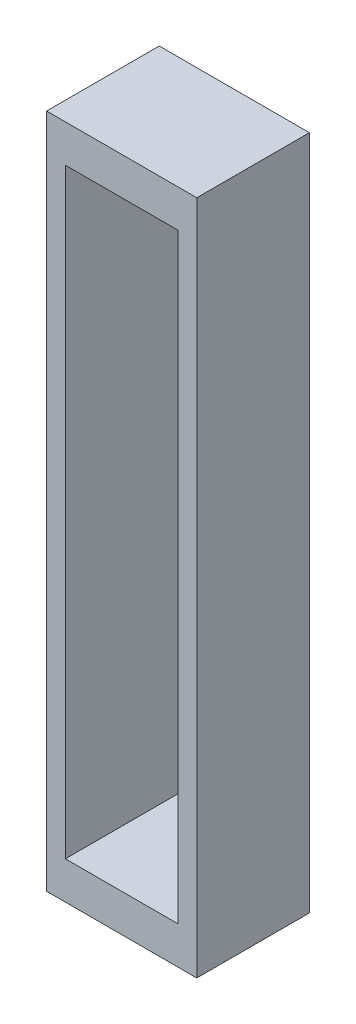
ISO-10303-21;
HEADER;
FILE_DESCRIPTION(('STEP AP214'),'2;1');
FILE_NAME('part.step','',(''),(''),'','','');
FILE_SCHEMA(('AUTOMOTIVE_DESIGN { 1 0 10303 214 1 1 1 1 }'));
ENDSEC;
DATA;
#1=APPLICATION_CONTEXT('core data for automotive mechanical design processes');
#2=APPLICATION_PROTOCOL_DEFINITION('international standard','automotive_design',2000,#1);
#3=PRODUCT_CONTEXT('',#1,'mechanical');
#4=PRODUCT('Part','Part','',(#3));
#5=PRODUCT_RELATED_PRODUCT_CATEGORY('part','',(#4));
#6=PRODUCT_DEFINITION_FORMATION('','',#4);
#7=PRODUCT_DEFINITION_CONTEXT('part definition',#1,'design');
#8=PRODUCT_DEFINITION('design','',#6,#7);
#9=PRODUCT_DEFINITION_SHAPE('','',#8);
#10=(LENGTH_UNIT() NAMED_UNIT(*) SI_UNIT(.MILLI.,.METRE.));
#11=(NAMED_UNIT(*) PLANE_ANGLE_UNIT() SI_UNIT($,.RADIAN.));
#12=(NAMED_UNIT(*) SI_UNIT($,.STERADIAN.) SOLID_ANGLE_UNIT());
#13=UNCERTAINTY_MEASURE_WITH_UNIT(LENGTH_MEASURE(1.E-05),#10,'distance_accuracy_value','');
#14=(GEOMETRIC_REPRESENTATION_CONTEXT(3) GLOBAL_UNCERTAINTY_ASSIGNED_CONTEXT((#13)) GLOBAL_UNIT_ASSIGNED_CONTEXT((#10,
#11,#12)) REPRESENTATION_CONTEXT('',''));
#15=CARTESIAN_POINT('',(0.,0.,0.));
#16=DIRECTION('',(0.,0.,1.));
#17=DIRECTION('',(1.,0.,0.));
#18=AXIS2_PLACEMENT_3D('',#15,#16,#17);
#19=CARTESIAN_POINT('',(0.,0.,30.));
#20=DIRECTION('',(0.,0.,-1.));
#21=DIRECTION('',(-1.,0.,0.));
#22=AXIS2_PLACEMENT_3D('',#19,#20,#21);
#23=PLANE('',#22);
#24=DIRECTION('',(0.,1.,0.));
#25=VECTOR('',#24,1.);
#26=CARTESIAN_POINT('',(20.,0.,30.));
#27=LINE('',#26,#25);
#28=CARTESIAN_POINT('',(20.,0.,30.));
#29=VERTEX_POINT('',#28);
#30=CARTESIAN_POINT('',(20.,180.,30.));
#31=VERTEX_POINT('',#30);
#32=EDGE_CURVE('E139',#29,#31,#27,.T.);
#33=ORIENTED_EDGE('',*,*,#32,.T.);
#34=DIRECTION('',(-1.,0.,0.));
#35=VECTOR('',#34,1.);
#36=CARTESIAN_POINT('',(-20.,180.,30.));
#37=LINE('',#36,#35);
#38=CARTESIAN_POINT('',(-20.,180.,30.));
#39=VERTEX_POINT('',#38);
#40=EDGE_CURVE('E141',#31,#39,#37,.T.);
#41=ORIENTED_EDGE('',*,*,#40,.T.);
#42=DIRECTION('',(0.,-1.,0.));
#43=VECTOR('',#42,1.);
#44=CARTESIAN_POINT('',(-20.,0.,30.));
#45=LINE('',#44,#43);
#46=CARTESIAN_POINT('',(-20.,0.,30.));
#47=VERTEX_POINT('',#46);
#48=EDGE_CURVE('E148',#39,#47,#45,.T.);
#49=ORIENTED_EDGE('',*,*,#48,.T.);
#50=DIRECTION('',(1.,0.,0.));
#51=VECTOR('',#50,1.);
#52=CARTESIAN_POINT('',(-20.,0.,30.));
#53=LINE('',#52,#51);
#54=EDGE_CURVE('E146',#47,#29,#53,.T.);
#55=ORIENTED_EDGE('',*,*,#54,.T.);
#56=EDGE_LOOP('',(#33,#41,#49,#55));
#57=FACE_BOUND('',#56,.T.);
#58=DIRECTION('',(0.,1.,0.));
#59=VECTOR('',#58,1.);
#60=CARTESIAN_POINT('',(15.,10.,30.));
#61=LINE('',#60,#59);
#62=CARTESIAN_POINT('',(15.,10.,30.));
#63=VERTEX_POINT('',#62);
#64=CARTESIAN_POINT('',(15.,170.,30.));
#65=VERTEX_POINT('',#64);
#66=EDGE_CURVE('E102',#63,#65,#61,.T.);
#67=ORIENTED_EDGE('',*,*,#66,.F.);
#68=DIRECTION('',(1.,0.,0.));
#69=VECTOR('',#68,1.);
#70=CARTESIAN_POINT('',(-15.,10.,30.));
#71=LINE('',#70,#69);
#72=CARTESIAN_POINT('',(-15.,10.,30.));
#73=VERTEX_POINT('',#72);
#74=EDGE_CURVE('E127',#73,#63,#71,.T.);
#75=ORIENTED_EDGE('',*,*,#74,.F.);
#76=DIRECTION('',(0.,-1.,0.));
#77=VECTOR('',#76,1.);
#78=CARTESIAN_POINT('',(-15.,10.,30.));
#79=LINE('',#78,#77);
#80=CARTESIAN_POINT('',(-15.,170.,30.));
#81=VERTEX_POINT('',#80);
#82=EDGE_CURVE('E122',#81,#73,#79,.T.);
#83=ORIENTED_EDGE('',*,*,#82,.F.);
#84=DIRECTION('',(-1.,0.,0.));
#85=VECTOR('',#84,1.);
#86=CARTESIAN_POINT('',(-15.,170.,30.));
#87=LINE('',#86,#85);
#88=EDGE_CURVE('E115',#65,#81,#87,.T.);
#89=ORIENTED_EDGE('',*,*,#88,.F.);
#90=EDGE_LOOP('',(#67,#75,#83,#89));
#91=FACE_BOUND('',#90,.T.);
#92=ADVANCED_FACE('F39',(#57,#91),#23,.F.);
#93=CARTESIAN_POINT('',(0.,0.,0.));
#94=DIRECTION('',(0.,0.,-1.));
#95=DIRECTION('',(-1.,0.,0.));
#96=AXIS2_PLACEMENT_3D('',#93,#94,#95);
#97=PLANE('',#96);
#98=DIRECTION('',(0.,1.,0.));
#99=VECTOR('',#98,1.);
#100=CARTESIAN_POINT('',(20.,0.,0.));
#101=LINE('',#100,#99);
#102=CARTESIAN_POINT('',(20.,0.,0.));
#103=VERTEX_POINT('',#102);
#104=CARTESIAN_POINT('',(20.,180.,0.));
#105=VERTEX_POINT('',#104);
#106=EDGE_CURVE('E116',#103,#105,#101,.T.);
#107=ORIENTED_EDGE('',*,*,#106,.F.);
#108=DIRECTION('',(1.,0.,0.));
#109=VECTOR('',#108,1.);
#110=CARTESIAN_POINT('',(-20.,0.,0.));
#111=LINE('',#110,#109);
#112=CARTESIAN_POINT('',(-20.,0.,0.));
#113=VERTEX_POINT('',#112);
#114=EDGE_CURVE('E145',#113,#103,#111,.T.);
#115=ORIENTED_EDGE('',*,*,#114,.F.);
#116=DIRECTION('',(0.,-1.,0.));
#117=VECTOR('',#116,1.);
#118=CARTESIAN_POINT('',(-20.,0.,0.));
#119=LINE('',#118,#117);
#120=CARTESIAN_POINT('',(-20.,180.,0.));
#121=VERTEX_POINT('',#120);
#122=EDGE_CURVE('E154',#121,#113,#119,.T.);
#123=ORIENTED_EDGE('',*,*,#122,.F.);
#124=DIRECTION('',(-1.,0.,0.));
#125=VECTOR('',#124,1.);
#126=CARTESIAN_POINT('',(-20.,180.,0.));
#127=LINE('',#126,#125);
#128=EDGE_CURVE('E153',#105,#121,#127,.T.);
#129=ORIENTED_EDGE('',*,*,#128,.F.);
#130=EDGE_LOOP('',(#107,#115,#123,#129));
#131=FACE_BOUND('',#130,.T.);
#132=DIRECTION('',(1.,0.,0.));
#133=VECTOR('',#132,1.);
#134=CARTESIAN_POINT('',(-15.,10.,0.));
#135=LINE('',#134,#133);
#136=CARTESIAN_POINT('',(-15.,10.,0.));
#137=VERTEX_POINT('',#136);
#138=CARTESIAN_POINT('',(15.,10.,0.));
#139=VERTEX_POINT('',#138);
#140=EDGE_CURVE('E114',#137,#139,#135,.T.);
#141=ORIENTED_EDGE('',*,*,#140,.T.);
#142=DIRECTION('',(0.,1.,0.));
#143=VECTOR('',#142,1.);
#144=CARTESIAN_POINT('',(15.,10.,0.));
#145=LINE('',#144,#143);
#146=CARTESIAN_POINT('',(15.,170.,0.));
#147=VERTEX_POINT('',#146);
#148=EDGE_CURVE('E64',#139,#147,#145,.T.);
#149=ORIENTED_EDGE('',*,*,#148,.T.);
#150=DIRECTION('',(-1.,0.,0.));
#151=VECTOR('',#150,1.);
#152=CARTESIAN_POINT('',(-15.,170.,0.));
#153=LINE('',#152,#151);
#154=CARTESIAN_POINT('',(-15.,170.,0.));
#155=VERTEX_POINT('',#154);
#156=EDGE_CURVE('E120',#147,#155,#153,.T.);
#157=ORIENTED_EDGE('',*,*,#156,.T.);
#158=DIRECTION('',(0.,-1.,0.));
#159=VECTOR('',#158,1.);
#160=CARTESIAN_POINT('',(-15.,10.,0.));
#161=LINE('',#160,#159);
#162=EDGE_CURVE('E134',#155,#137,#161,.T.);
#163=ORIENTED_EDGE('',*,*,#162,.T.);
#164=EDGE_LOOP('',(#141,#149,#157,#163));
#165=FACE_BOUND('',#164,.T.);
#166=ADVANCED_FACE('F172',(#131,#165),#97,.T.);
#167=CARTESIAN_POINT('',(20.,0.,30.));
#168=DIRECTION('',(-1.,0.,0.));
#169=DIRECTION('',(0.,0.,1.));
#170=AXIS2_PLACEMENT_3D('',#167,#168,#169);
#171=PLANE('',#170);
#172=ORIENTED_EDGE('',*,*,#106,.T.);
#173=DIRECTION('',(0.,0.,-1.));
#174=VECTOR('',#173,1.);
#175=CARTESIAN_POINT('',(20.,180.,30.));
#176=LINE('',#175,#174);
#177=EDGE_CURVE('E11',#31,#105,#176,.T.);
#178=ORIENTED_EDGE('',*,*,#177,.F.);
#179=ORIENTED_EDGE('',*,*,#32,.F.);
#180=DIRECTION('',(0.,0.,-1.));
#181=VECTOR('',#180,1.);
#182=CARTESIAN_POINT('',(20.,0.,30.));
#183=LINE('',#182,#181);
#184=EDGE_CURVE('E147',#29,#103,#183,.T.);
#185=ORIENTED_EDGE('',*,*,#184,.T.);
#186=EDGE_LOOP('',(#172,#178,#179,#185));
#187=FACE_BOUND('',#186,.T.);
#188=ADVANCED_FACE('F41',(#187),#171,.F.);
#189=CARTESIAN_POINT('',(-20.,180.,30.));
#190=DIRECTION('',(0.,-1.,0.));
#191=DIRECTION('',(0.,0.,-1.));
#192=AXIS2_PLACEMENT_3D('',#189,#190,#191);
#193=PLANE('',#192);
#194=ORIENTED_EDGE('',*,*,#128,.T.);
#195=DIRECTION('',(0.,0.,-1.));
#196=VECTOR('',#195,1.);
#197=CARTESIAN_POINT('',(-20.,180.,30.));
#198=LINE('',#197,#196);
#199=EDGE_CURVE('E50',#39,#121,#198,.T.);
#200=ORIENTED_EDGE('',*,*,#199,.F.);
#201=ORIENTED_EDGE('',*,*,#40,.F.);
#202=ORIENTED_EDGE('',*,*,#177,.T.);
#203=EDGE_LOOP('',(#194,#200,#201,#202));
#204=FACE_BOUND('',#203,.T.);
#205=ADVANCED_FACE('F181',(#204),#193,.F.);
#206=CARTESIAN_POINT('',(-20.,0.,30.));
#207=DIRECTION('',(1.,0.,0.));
#208=DIRECTION('',(0.,0.,-1.));
#209=AXIS2_PLACEMENT_3D('',#206,#207,#208);
#210=PLANE('',#209);
#211=ORIENTED_EDGE('',*,*,#122,.T.);
#212=DIRECTION('',(0.,0.,-1.));
#213=VECTOR('',#212,1.);
#214=CARTESIAN_POINT('',(-20.,0.,30.));
#215=LINE('',#214,#213);
#216=EDGE_CURVE('E159',#47,#113,#215,.T.);
#217=ORIENTED_EDGE('',*,*,#216,.F.);
#218=ORIENTED_EDGE('',*,*,#48,.F.);
#219=ORIENTED_EDGE('',*,*,#199,.T.);
#220=EDGE_LOOP('',(#211,#217,#218,#219));
#221=FACE_BOUND('',#220,.T.);
#222=ADVANCED_FACE('F170',(#221),#210,.F.);
#223=CARTESIAN_POINT('',(-20.,0.,30.));
#224=DIRECTION('',(0.,1.,0.));
#225=DIRECTION('',(0.,0.,1.));
#226=AXIS2_PLACEMENT_3D('',#223,#224,#225);
#227=PLANE('',#226);
#228=ORIENTED_EDGE('',*,*,#114,.T.);
#229=ORIENTED_EDGE('',*,*,#184,.F.);
#230=ORIENTED_EDGE('',*,*,#54,.F.);
#231=ORIENTED_EDGE('',*,*,#216,.T.);
#232=EDGE_LOOP('',(#228,#229,#230,#231));
#233=FACE_BOUND('',#232,.T.);
#234=ADVANCED_FACE('F180',(#233),#227,.F.);
#235=CARTESIAN_POINT('',(15.,10.,30.));
#236=DIRECTION('',(-1.,0.,0.));
#237=DIRECTION('',(0.,0.,1.));
#238=AXIS2_PLACEMENT_3D('',#235,#236,#237);
#239=PLANE('',#238);
#240=ORIENTED_EDGE('',*,*,#148,.F.);
#241=DIRECTION('',(0.,0.,-1.));
#242=VECTOR('',#241,1.);
#243=CARTESIAN_POINT('',(15.,10.,30.));
#244=LINE('',#243,#242);
#245=EDGE_CURVE('E107',#63,#139,#244,.T.);
#246=ORIENTED_EDGE('',*,*,#245,.F.);
#247=ORIENTED_EDGE('',*,*,#66,.T.);
#248=DIRECTION('',(0.,0.,-1.));
#249=VECTOR('',#248,1.);
#250=CARTESIAN_POINT('',(15.,170.,30.));
#251=LINE('',#250,#249);
#252=EDGE_CURVE('E110',#65,#147,#251,.T.);
#253=ORIENTED_EDGE('',*,*,#252,.T.);
#254=EDGE_LOOP('',(#240,#246,#247,#253));
#255=FACE_BOUND('',#254,.T.);
#256=ADVANCED_FACE('F106',(#255),#239,.T.);
#257=CARTESIAN_POINT('',(-15.,170.,30.));
#258=DIRECTION('',(0.,-1.,0.));
#259=DIRECTION('',(0.,0.,-1.));
#260=AXIS2_PLACEMENT_3D('',#257,#258,#259);
#261=PLANE('',#260);
#262=ORIENTED_EDGE('',*,*,#156,.F.);
#263=ORIENTED_EDGE('',*,*,#252,.F.);
#264=ORIENTED_EDGE('',*,*,#88,.T.);
#265=DIRECTION('',(0.,0.,-1.));
#266=VECTOR('',#265,1.);
#267=CARTESIAN_POINT('',(-15.,170.,30.));
#268=LINE('',#267,#266);
#269=EDGE_CURVE('E121',#81,#155,#268,.T.);
#270=ORIENTED_EDGE('',*,*,#269,.T.);
#271=EDGE_LOOP('',(#262,#263,#264,#270));
#272=FACE_BOUND('',#271,.T.);
#273=ADVANCED_FACE('F118',(#272),#261,.T.);
#274=CARTESIAN_POINT('',(-15.,10.,30.));
#275=DIRECTION('',(1.,0.,0.));
#276=DIRECTION('',(0.,0.,-1.));
#277=AXIS2_PLACEMENT_3D('',#274,#275,#276);
#278=PLANE('',#277);
#279=ORIENTED_EDGE('',*,*,#162,.F.);
#280=ORIENTED_EDGE('',*,*,#269,.F.);
#281=ORIENTED_EDGE('',*,*,#82,.T.);
#282=DIRECTION('',(0.,0.,-1.));
#283=VECTOR('',#282,1.);
#284=CARTESIAN_POINT('',(-15.,10.,30.));
#285=LINE('',#284,#283);
#286=EDGE_CURVE('E53',#73,#137,#285,.T.);
#287=ORIENTED_EDGE('',*,*,#286,.T.);
#288=EDGE_LOOP('',(#279,#280,#281,#287));
#289=FACE_BOUND('',#288,.T.);
#290=ADVANCED_FACE('F206',(#289),#278,.T.);
#291=CARTESIAN_POINT('',(-15.,10.,30.));
#292=DIRECTION('',(0.,1.,0.));
#293=DIRECTION('',(0.,0.,1.));
#294=AXIS2_PLACEMENT_3D('',#291,#292,#293);
#295=PLANE('',#294);
#296=ORIENTED_EDGE('',*,*,#140,.F.);
#297=ORIENTED_EDGE('',*,*,#286,.F.);
#298=ORIENTED_EDGE('',*,*,#74,.T.);
#299=ORIENTED_EDGE('',*,*,#245,.T.);
#300=EDGE_LOOP('',(#296,#297,#298,#299));
#301=FACE_BOUND('',#300,.T.);
#302=ADVANCED_FACE('F209',(#301),#295,.T.);
#303=CLOSED_SHELL('',(#92,#166,#188,#205,#222,#234,#256,#273,#290,#302));
#304=MANIFOLD_SOLID_BREP('B2',#303);
#305=ADVANCED_BREP_SHAPE_REPRESENTATION('',(#18,#304),#14);
#306=SHAPE_DEFINITION_REPRESENTATION(#9,#305);
ENDSEC;
END-ISO-10303-21;
